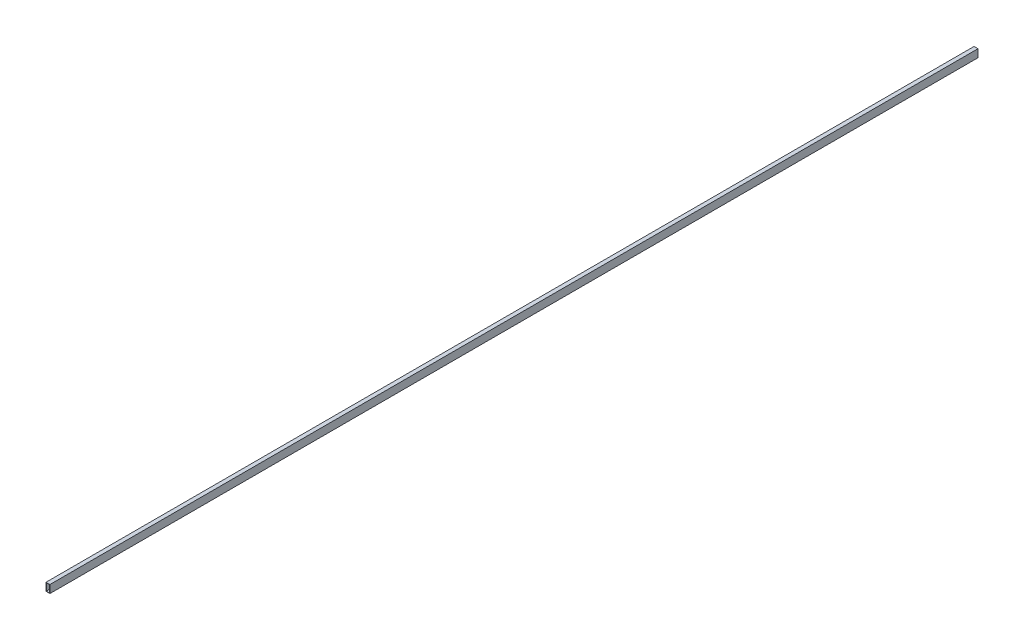
ISO-10303-21;
HEADER;
FILE_DESCRIPTION(('STEP AP214'),'2;1');
FILE_NAME('part.step','',(''),(''),'','','');
FILE_SCHEMA(('AUTOMOTIVE_DESIGN { 1 0 10303 214 1 1 1 1 }'));
ENDSEC;
DATA;
#1=APPLICATION_CONTEXT('core data for automotive mechanical design processes');
#2=APPLICATION_PROTOCOL_DEFINITION('international standard','automotive_design',2000,#1);
#3=PRODUCT_CONTEXT('',#1,'mechanical');
#4=PRODUCT('Part','Part','',(#3));
#5=PRODUCT_RELATED_PRODUCT_CATEGORY('part','',(#4));
#6=PRODUCT_DEFINITION_FORMATION('','',#4);
#7=PRODUCT_DEFINITION_CONTEXT('part definition',#1,'design');
#8=PRODUCT_DEFINITION('design','',#6,#7);
#9=PRODUCT_DEFINITION_SHAPE('','',#8);
#10=(LENGTH_UNIT() NAMED_UNIT(*) SI_UNIT(.MILLI.,.METRE.));
#11=(NAMED_UNIT(*) PLANE_ANGLE_UNIT() SI_UNIT($,.RADIAN.));
#12=(NAMED_UNIT(*) SI_UNIT($,.STERADIAN.) SOLID_ANGLE_UNIT());
#13=UNCERTAINTY_MEASURE_WITH_UNIT(LENGTH_MEASURE(1.E-05),#10,'distance_accuracy_value','');
#14=(GEOMETRIC_REPRESENTATION_CONTEXT(3) GLOBAL_UNCERTAINTY_ASSIGNED_CONTEXT((#13)) GLOBAL_UNIT_ASSIGNED_CONTEXT((#10,
#11,#12)) REPRESENTATION_CONTEXT('',''));
#15=CARTESIAN_POINT('',(0.,0.,0.));
#16=DIRECTION('',(0.,0.,1.));
#17=DIRECTION('',(1.,0.,0.));
#18=AXIS2_PLACEMENT_3D('',#15,#16,#17);
#19=CARTESIAN_POINT('',(0.,0.,6000.));
#20=DIRECTION('',(0.,0.,-1.));
#21=DIRECTION('',(-1.,0.,0.));
#22=AXIS2_PLACEMENT_3D('',#19,#20,#21);
#23=PLANE('',#22);
#24=DIRECTION('',(0.,1.,0.));
#25=VECTOR('',#24,1.);
#26=CARTESIAN_POINT('',(12.7,-25.4,6000.));
#27=LINE('',#26,#25);
#28=CARTESIAN_POINT('',(12.7,-25.4,6000.));
#29=VERTEX_POINT('',#28);
#30=CARTESIAN_POINT('',(12.7,25.4,6000.));
#31=VERTEX_POINT('',#30);
#32=EDGE_CURVE('E134',#29,#31,#27,.T.);
#33=ORIENTED_EDGE('',*,*,#32,.T.);
#34=DIRECTION('',(-1.,0.,0.));
#35=VECTOR('',#34,1.);
#36=CARTESIAN_POINT('',(-12.7,25.4,6000.));
#37=LINE('',#36,#35);
#38=CARTESIAN_POINT('',(-12.7,25.4,6000.));
#39=VERTEX_POINT('',#38);
#40=EDGE_CURVE('E137',#31,#39,#37,.T.);
#41=ORIENTED_EDGE('',*,*,#40,.T.);
#42=DIRECTION('',(0.,-1.,0.));
#43=VECTOR('',#42,1.);
#44=CARTESIAN_POINT('',(-12.7,-25.4,6000.));
#45=LINE('',#44,#43);
#46=CARTESIAN_POINT('',(-12.7,-25.4,6000.));
#47=VERTEX_POINT('',#46);
#48=EDGE_CURVE('E140',#39,#47,#45,.T.);
#49=ORIENTED_EDGE('',*,*,#48,.T.);
#50=DIRECTION('',(1.,0.,0.));
#51=VECTOR('',#50,1.);
#52=CARTESIAN_POINT('',(-12.7,-25.4,6000.));
#53=LINE('',#52,#51);
#54=EDGE_CURVE('E142',#47,#29,#53,.T.);
#55=ORIENTED_EDGE('',*,*,#54,.T.);
#56=EDGE_LOOP('',(#33,#41,#49,#55));
#57=FACE_BOUND('',#56,.T.);
#58=DIRECTION('',(1.,0.,0.));
#59=VECTOR('',#58,1.);
#60=CARTESIAN_POINT('',(-10.81,-23.51,6000.));
#61=LINE('',#60,#59);
#62=CARTESIAN_POINT('',(-10.81,-23.51,6000.));
#63=VERTEX_POINT('',#62);
#64=CARTESIAN_POINT('',(10.81,-23.51,6000.));
#65=VERTEX_POINT('',#64);
#66=EDGE_CURVE('E98',#63,#65,#61,.T.);
#67=ORIENTED_EDGE('',*,*,#66,.F.);
#68=DIRECTION('',(0.,-1.,0.));
#69=VECTOR('',#68,1.);
#70=CARTESIAN_POINT('',(-10.81,-23.51,6000.));
#71=LINE('',#70,#69);
#72=CARTESIAN_POINT('',(-10.81,23.51,6000.));
#73=VERTEX_POINT('',#72);
#74=EDGE_CURVE('E120',#73,#63,#71,.T.);
#75=ORIENTED_EDGE('',*,*,#74,.F.);
#76=DIRECTION('',(-1.,0.,0.));
#77=VECTOR('',#76,1.);
#78=CARTESIAN_POINT('',(-10.81,23.51,6000.));
#79=LINE('',#78,#77);
#80=CARTESIAN_POINT('',(10.81,23.51,6000.));
#81=VERTEX_POINT('',#80);
#82=EDGE_CURVE('E118',#81,#73,#79,.T.);
#83=ORIENTED_EDGE('',*,*,#82,.F.);
#84=DIRECTION('',(0.,1.,0.));
#85=VECTOR('',#84,1.);
#86=CARTESIAN_POINT('',(10.81,-23.51,6000.));
#87=LINE('',#86,#85);
#88=EDGE_CURVE('E106',#65,#81,#87,.T.);
#89=ORIENTED_EDGE('',*,*,#88,.F.);
#90=EDGE_LOOP('',(#67,#75,#83,#89));
#91=FACE_BOUND('',#90,.T.);
#92=ADVANCED_FACE('F33',(#57,#91),#23,.F.);
#93=CARTESIAN_POINT('',(0.,0.,0.));
#94=DIRECTION('',(0.,0.,-1.));
#95=DIRECTION('',(-1.,0.,0.));
#96=AXIS2_PLACEMENT_3D('',#93,#94,#95);
#97=PLANE('',#96);
#98=DIRECTION('',(0.,1.,0.));
#99=VECTOR('',#98,1.);
#100=CARTESIAN_POINT('',(12.7,-25.4,0.));
#101=LINE('',#100,#99);
#102=CARTESIAN_POINT('',(12.7,-25.4,0.));
#103=VERTEX_POINT('',#102);
#104=CARTESIAN_POINT('',(12.7,25.4,0.));
#105=VERTEX_POINT('',#104);
#106=EDGE_CURVE('E114',#103,#105,#101,.T.);
#107=ORIENTED_EDGE('',*,*,#106,.F.);
#108=DIRECTION('',(1.,0.,0.));
#109=VECTOR('',#108,1.);
#110=CARTESIAN_POINT('',(-12.7,-25.4,0.));
#111=LINE('',#110,#109);
#112=CARTESIAN_POINT('',(-12.7,-25.4,0.));
#113=VERTEX_POINT('',#112);
#114=EDGE_CURVE('E138',#113,#103,#111,.T.);
#115=ORIENTED_EDGE('',*,*,#114,.F.);
#116=DIRECTION('',(0.,-1.,0.));
#117=VECTOR('',#116,1.);
#118=CARTESIAN_POINT('',(-12.7,-25.4,0.));
#119=LINE('',#118,#117);
#120=CARTESIAN_POINT('',(-12.7,25.4,0.));
#121=VERTEX_POINT('',#120);
#122=EDGE_CURVE('E149',#121,#113,#119,.T.);
#123=ORIENTED_EDGE('',*,*,#122,.F.);
#124=DIRECTION('',(-1.,0.,0.));
#125=VECTOR('',#124,1.);
#126=CARTESIAN_POINT('',(-12.7,25.4,0.));
#127=LINE('',#126,#125);
#128=EDGE_CURVE('E147',#105,#121,#127,.T.);
#129=ORIENTED_EDGE('',*,*,#128,.F.);
#130=EDGE_LOOP('',(#107,#115,#123,#129));
#131=FACE_BOUND('',#130,.T.);
#132=DIRECTION('',(0.,-1.,0.));
#133=VECTOR('',#132,1.);
#134=CARTESIAN_POINT('',(-10.81,-23.51,0.));
#135=LINE('',#134,#133);
#136=CARTESIAN_POINT('',(-10.81,23.51,0.));
#137=VERTEX_POINT('',#136);
#138=CARTESIAN_POINT('',(-10.81,-23.51,0.));
#139=VERTEX_POINT('',#138);
#140=EDGE_CURVE('E107',#137,#139,#135,.T.);
#141=ORIENTED_EDGE('',*,*,#140,.T.);
#142=DIRECTION('',(1.,0.,0.));
#143=VECTOR('',#142,1.);
#144=CARTESIAN_POINT('',(-10.81,-23.51,0.));
#145=LINE('',#144,#143);
#146=CARTESIAN_POINT('',(10.81,-23.51,0.));
#147=VERTEX_POINT('',#146);
#148=EDGE_CURVE('E56',#139,#147,#145,.T.);
#149=ORIENTED_EDGE('',*,*,#148,.T.);
#150=DIRECTION('',(0.,1.,0.));
#151=VECTOR('',#150,1.);
#152=CARTESIAN_POINT('',(10.81,-23.51,0.));
#153=LINE('',#152,#151);
#154=CARTESIAN_POINT('',(10.81,23.51,0.));
#155=VERTEX_POINT('',#154);
#156=EDGE_CURVE('E113',#147,#155,#153,.T.);
#157=ORIENTED_EDGE('',*,*,#156,.T.);
#158=DIRECTION('',(-1.,0.,0.));
#159=VECTOR('',#158,1.);
#160=CARTESIAN_POINT('',(-10.81,23.51,0.));
#161=LINE('',#160,#159);
#162=EDGE_CURVE('E126',#155,#137,#161,.T.);
#163=ORIENTED_EDGE('',*,*,#162,.T.);
#164=EDGE_LOOP('',(#141,#149,#157,#163));
#165=FACE_BOUND('',#164,.T.);
#166=ADVANCED_FACE('F167',(#131,#165),#97,.T.);
#167=CARTESIAN_POINT('',(12.7,-25.4,6000.));
#168=DIRECTION('',(-1.,0.,0.));
#169=DIRECTION('',(0.,0.,1.));
#170=AXIS2_PLACEMENT_3D('',#167,#168,#169);
#171=PLANE('',#170);
#172=ORIENTED_EDGE('',*,*,#106,.T.);
#173=DIRECTION('',(0.,0.,-1.));
#174=VECTOR('',#173,1.);
#175=CARTESIAN_POINT('',(12.7,25.4,6000.));
#176=LINE('',#175,#174);
#177=EDGE_CURVE('E11',#31,#105,#176,.T.);
#178=ORIENTED_EDGE('',*,*,#177,.F.);
#179=ORIENTED_EDGE('',*,*,#32,.F.);
#180=DIRECTION('',(0.,0.,-1.));
#181=VECTOR('',#180,1.);
#182=CARTESIAN_POINT('',(12.7,-25.4,6000.));
#183=LINE('',#182,#181);
#184=EDGE_CURVE('E144',#29,#103,#183,.T.);
#185=ORIENTED_EDGE('',*,*,#184,.T.);
#186=EDGE_LOOP('',(#172,#178,#179,#185));
#187=FACE_BOUND('',#186,.T.);
#188=ADVANCED_FACE('F35',(#187),#171,.F.);
#189=CARTESIAN_POINT('',(-12.7,25.4,6000.));
#190=DIRECTION('',(0.,-1.,0.));
#191=DIRECTION('',(0.,0.,-1.));
#192=AXIS2_PLACEMENT_3D('',#189,#190,#191);
#193=PLANE('',#192);
#194=ORIENTED_EDGE('',*,*,#128,.T.);
#195=DIRECTION('',(0.,0.,-1.));
#196=VECTOR('',#195,1.);
#197=CARTESIAN_POINT('',(-12.7,25.4,6000.));
#198=LINE('',#197,#196);
#199=EDGE_CURVE('E41',#39,#121,#198,.T.);
#200=ORIENTED_EDGE('',*,*,#199,.F.);
#201=ORIENTED_EDGE('',*,*,#40,.F.);
#202=ORIENTED_EDGE('',*,*,#177,.T.);
#203=EDGE_LOOP('',(#194,#200,#201,#202));
#204=FACE_BOUND('',#203,.T.);
#205=ADVANCED_FACE('F177',(#204),#193,.F.);
#206=CARTESIAN_POINT('',(-12.7,-25.4,6000.));
#207=DIRECTION('',(1.,0.,0.));
#208=DIRECTION('',(0.,0.,-1.));
#209=AXIS2_PLACEMENT_3D('',#206,#207,#208);
#210=PLANE('',#209);
#211=ORIENTED_EDGE('',*,*,#122,.T.);
#212=DIRECTION('',(0.,0.,-1.));
#213=VECTOR('',#212,1.);
#214=CARTESIAN_POINT('',(-12.7,-25.4,6000.));
#215=LINE('',#214,#213);
#216=EDGE_CURVE('E154',#47,#113,#215,.T.);
#217=ORIENTED_EDGE('',*,*,#216,.F.);
#218=ORIENTED_EDGE('',*,*,#48,.F.);
#219=ORIENTED_EDGE('',*,*,#199,.T.);
#220=EDGE_LOOP('',(#211,#217,#218,#219));
#221=FACE_BOUND('',#220,.T.);
#222=ADVANCED_FACE('F161',(#221),#210,.F.);
#223=CARTESIAN_POINT('',(-12.7,-25.4,6000.));
#224=DIRECTION('',(0.,1.,0.));
#225=DIRECTION('',(0.,0.,1.));
#226=AXIS2_PLACEMENT_3D('',#223,#224,#225);
#227=PLANE('',#226);
#228=ORIENTED_EDGE('',*,*,#114,.T.);
#229=ORIENTED_EDGE('',*,*,#184,.F.);
#230=ORIENTED_EDGE('',*,*,#54,.F.);
#231=ORIENTED_EDGE('',*,*,#216,.T.);
#232=EDGE_LOOP('',(#228,#229,#230,#231));
#233=FACE_BOUND('',#232,.T.);
#234=ADVANCED_FACE('F171',(#233),#227,.F.);
#235=CARTESIAN_POINT('',(-10.81,-23.51,6000.));
#236=DIRECTION('',(0.,1.,0.));
#237=DIRECTION('',(0.,0.,1.));
#238=AXIS2_PLACEMENT_3D('',#235,#236,#237);
#239=PLANE('',#238);
#240=ORIENTED_EDGE('',*,*,#148,.F.);
#241=DIRECTION('',(0.,0.,-1.));
#242=VECTOR('',#241,1.);
#243=CARTESIAN_POINT('',(-10.81,-23.51,6000.));
#244=LINE('',#243,#242);
#245=EDGE_CURVE('E102',#63,#139,#244,.T.);
#246=ORIENTED_EDGE('',*,*,#245,.F.);
#247=ORIENTED_EDGE('',*,*,#66,.T.);
#248=DIRECTION('',(0.,0.,-1.));
#249=VECTOR('',#248,1.);
#250=CARTESIAN_POINT('',(10.81,-23.51,6000.));
#251=LINE('',#250,#249);
#252=EDGE_CURVE('E101',#65,#147,#251,.T.);
#253=ORIENTED_EDGE('',*,*,#252,.T.);
#254=EDGE_LOOP('',(#240,#246,#247,#253));
#255=FACE_BOUND('',#254,.T.);
#256=ADVANCED_FACE('F100',(#255),#239,.T.);
#257=CARTESIAN_POINT('',(10.81,-23.51,6000.));
#258=DIRECTION('',(-1.,0.,0.));
#259=DIRECTION('',(0.,0.,1.));
#260=AXIS2_PLACEMENT_3D('',#257,#258,#259);
#261=PLANE('',#260);
#262=ORIENTED_EDGE('',*,*,#156,.F.);
#263=ORIENTED_EDGE('',*,*,#252,.F.);
#264=ORIENTED_EDGE('',*,*,#88,.T.);
#265=DIRECTION('',(0.,0.,-1.));
#266=VECTOR('',#265,1.);
#267=CARTESIAN_POINT('',(10.81,23.51,6000.));
#268=LINE('',#267,#266);
#269=EDGE_CURVE('E115',#81,#155,#268,.T.);
#270=ORIENTED_EDGE('',*,*,#269,.T.);
#271=EDGE_LOOP('',(#262,#263,#264,#270));
#272=FACE_BOUND('',#271,.T.);
#273=ADVANCED_FACE('F110',(#272),#261,.T.);
#274=CARTESIAN_POINT('',(-10.81,23.51,6000.));
#275=DIRECTION('',(0.,-1.,0.));
#276=DIRECTION('',(1.,0.,0.));
#277=AXIS2_PLACEMENT_3D('',#274,#275,#276);
#278=PLANE('',#277);
#279=ORIENTED_EDGE('',*,*,#162,.F.);
#280=ORIENTED_EDGE('',*,*,#269,.F.);
#281=ORIENTED_EDGE('',*,*,#82,.T.);
#282=DIRECTION('',(0.,0.,-1.));
#283=VECTOR('',#282,1.);
#284=CARTESIAN_POINT('',(-10.81,23.51,6000.));
#285=LINE('',#284,#283);
#286=EDGE_CURVE('E48',#73,#137,#285,.T.);
#287=ORIENTED_EDGE('',*,*,#286,.T.);
#288=EDGE_LOOP('',(#279,#280,#281,#287));
#289=FACE_BOUND('',#288,.T.);
#290=ADVANCED_FACE('F200',(#289),#278,.T.);
#291=CARTESIAN_POINT('',(-10.81,-23.51,6000.));
#292=DIRECTION('',(1.,0.,0.));
#293=DIRECTION('',(0.,0.,-1.));
#294=AXIS2_PLACEMENT_3D('',#291,#292,#293);
#295=PLANE('',#294);
#296=ORIENTED_EDGE('',*,*,#140,.F.);
#297=ORIENTED_EDGE('',*,*,#286,.F.);
#298=ORIENTED_EDGE('',*,*,#74,.T.);
#299=ORIENTED_EDGE('',*,*,#245,.T.);
#300=EDGE_LOOP('',(#296,#297,#298,#299));
#301=FACE_BOUND('',#300,.T.);
#302=ADVANCED_FACE('F204',(#301),#295,.T.);
#303=CLOSED_SHELL('',(#92,#166,#188,#205,#222,#234,#256,#273,#290,#302));
#304=MANIFOLD_SOLID_BREP('B2',#303);
#305=ADVANCED_BREP_SHAPE_REPRESENTATION('',(#18,#304),#14);
#306=SHAPE_DEFINITION_REPRESENTATION(#9,#305);
ENDSEC;
END-ISO-10303-21;
